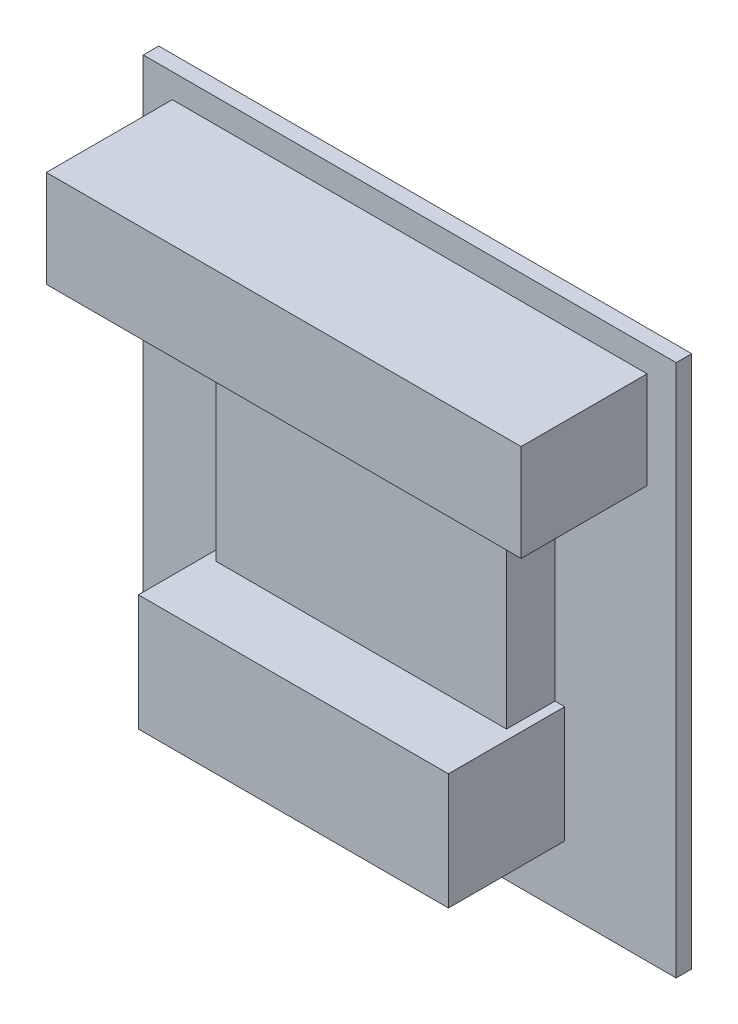
ISO-10303-21;
HEADER;
FILE_DESCRIPTION(('STEP AP214'),'2;1');
FILE_NAME('part.step','',(''),(''),'','','');
FILE_SCHEMA(('AUTOMOTIVE_DESIGN { 1 0 10303 214 1 1 1 1 }'));
ENDSEC;
DATA;
#1=APPLICATION_CONTEXT('core data for automotive mechanical design processes');
#2=APPLICATION_PROTOCOL_DEFINITION('international standard','automotive_design',2000,#1);
#3=PRODUCT_CONTEXT('',#1,'mechanical');
#4=PRODUCT('Part','Part','',(#3));
#5=PRODUCT_RELATED_PRODUCT_CATEGORY('part','',(#4));
#6=PRODUCT_DEFINITION_FORMATION('','',#4);
#7=PRODUCT_DEFINITION_CONTEXT('part definition',#1,'design');
#8=PRODUCT_DEFINITION('design','',#6,#7);
#9=PRODUCT_DEFINITION_SHAPE('','',#8);
#10=(LENGTH_UNIT() NAMED_UNIT(*) SI_UNIT(.MILLI.,.METRE.));
#11=(NAMED_UNIT(*) PLANE_ANGLE_UNIT() SI_UNIT($,.RADIAN.));
#12=(NAMED_UNIT(*) SI_UNIT($,.STERADIAN.) SOLID_ANGLE_UNIT());
#13=UNCERTAINTY_MEASURE_WITH_UNIT(LENGTH_MEASURE(1.E-05),#10,'distance_accuracy_value','');
#14=(GEOMETRIC_REPRESENTATION_CONTEXT(3) GLOBAL_UNCERTAINTY_ASSIGNED_CONTEXT((#13)) GLOBAL_UNIT_ASSIGNED_CONTEXT((#10,
#11,#12)) REPRESENTATION_CONTEXT('',''));
#15=CARTESIAN_POINT('',(0.,0.,0.));
#16=DIRECTION('',(0.,0.,1.));
#17=DIRECTION('',(1.,0.,0.));
#18=AXIS2_PLACEMENT_3D('',#15,#16,#17);
#19=CARTESIAN_POINT('',(-24.5,15.,14.6));
#20=DIRECTION('',(0.,0.,1.));
#21=DIRECTION('',(1.,0.,0.));
#22=AXIS2_PLACEMENT_3D('',#19,#20,#21);
#23=PLANE('',#22);
#24=DIRECTION('',(0.,1.,0.));
#25=VECTOR('',#24,1.);
#26=CARTESIAN_POINT('',(-24.5,15.,14.6));
#27=LINE('',#26,#25);
#28=CARTESIAN_POINT('',(-24.5,15.,14.6));
#29=VERTEX_POINT('',#28);
#30=CARTESIAN_POINT('',(-24.5,25.,14.6));
#31=VERTEX_POINT('',#30);
#32=EDGE_CURVE('E71',#29,#31,#27,.T.);
#33=ORIENTED_EDGE('',*,*,#32,.F.);
#34=DIRECTION('',(1.,0.,0.));
#35=VECTOR('',#34,1.);
#36=CARTESIAN_POINT('',(-24.5,15.,14.6));
#37=LINE('',#36,#35);
#38=CARTESIAN_POINT('',(24.5,15.,14.6));
#39=VERTEX_POINT('',#38);
#40=EDGE_CURVE('E19',#29,#39,#37,.T.);
#41=ORIENTED_EDGE('',*,*,#40,.T.);
#42=DIRECTION('',(0.,1.,0.));
#43=VECTOR('',#42,1.);
#44=CARTESIAN_POINT('',(24.5,15.,14.6));
#45=LINE('',#44,#43);
#46=CARTESIAN_POINT('',(24.5,25.,14.6));
#47=VERTEX_POINT('',#46);
#48=EDGE_CURVE('E26',#39,#47,#45,.T.);
#49=ORIENTED_EDGE('',*,*,#48,.T.);
#50=DIRECTION('',(1.,0.,0.));
#51=VECTOR('',#50,1.);
#52=CARTESIAN_POINT('',(-24.5,25.,14.6));
#53=LINE('',#52,#51);
#54=EDGE_CURVE('E10',#31,#47,#53,.T.);
#55=ORIENTED_EDGE('',*,*,#54,.F.);
#56=EDGE_LOOP('',(#33,#41,#49,#55));
#57=FACE_BOUND('',#56,.T.);
#58=ADVANCED_FACE('F16',(#57),#23,.T.);
#59=CARTESIAN_POINT('',(-15.,-10.,6.6));
#60=DIRECTION('',(0.,0.,1.));
#61=DIRECTION('',(1.,0.,0.));
#62=AXIS2_PLACEMENT_3D('',#59,#60,#61);
#63=PLANE('',#62);
#64=DIRECTION('',(0.,1.,0.));
#65=VECTOR('',#64,1.);
#66=CARTESIAN_POINT('',(-15.,-10.,6.6));
#67=LINE('',#66,#65);
#68=CARTESIAN_POINT('',(-15.,-9.,6.6));
#69=VERTEX_POINT('',#68);
#70=CARTESIAN_POINT('',(-15.,10.,6.6));
#71=VERTEX_POINT('',#70);
#72=EDGE_CURVE('E90',#69,#71,#67,.T.);
#73=ORIENTED_EDGE('',*,*,#72,.F.);
#74=DIRECTION('',(1.,0.,0.));
#75=VECTOR('',#74,1.);
#76=CARTESIAN_POINT('',(-15.5,-9.,6.6));
#77=LINE('',#76,#75);
#78=CARTESIAN_POINT('',(15.,-9.,6.6));
#79=VERTEX_POINT('',#78);
#80=EDGE_CURVE('E153',#69,#79,#77,.T.);
#81=ORIENTED_EDGE('',*,*,#80,.T.);
#82=DIRECTION('',(0.,1.,0.));
#83=VECTOR('',#82,1.);
#84=CARTESIAN_POINT('',(15.,-10.,6.6));
#85=LINE('',#84,#83);
#86=CARTESIAN_POINT('',(15.,10.,6.6));
#87=VERTEX_POINT('',#86);
#88=EDGE_CURVE('E161',#79,#87,#85,.T.);
#89=ORIENTED_EDGE('',*,*,#88,.T.);
#90=DIRECTION('',(1.,0.,0.));
#91=VECTOR('',#90,1.);
#92=CARTESIAN_POINT('',(-15.,10.,6.6));
#93=LINE('',#92,#91);
#94=EDGE_CURVE('E96',#71,#87,#93,.T.);
#95=ORIENTED_EDGE('',*,*,#94,.F.);
#96=EDGE_LOOP('',(#73,#81,#89,#95));
#97=FACE_BOUND('',#96,.T.);
#98=ADVANCED_FACE('F398',(#97),#63,.T.);
#99=CARTESIAN_POINT('',(-16.,-21.,13.6));
#100=DIRECTION('',(0.,0.,1.));
#101=DIRECTION('',(1.,0.,0.));
#102=AXIS2_PLACEMENT_3D('',#99,#100,#101);
#103=PLANE('',#102);
#104=DIRECTION('',(0.,1.,0.));
#105=VECTOR('',#104,1.);
#106=CARTESIAN_POINT('',(-16.,-21.,13.6));
#107=LINE('',#106,#105);
#108=CARTESIAN_POINT('',(-16.,-21.,13.6));
#109=VERTEX_POINT('',#108);
#110=CARTESIAN_POINT('',(-16.,-9.,13.6));
#111=VERTEX_POINT('',#110);
#112=EDGE_CURVE('E120',#109,#111,#107,.T.);
#113=ORIENTED_EDGE('',*,*,#112,.F.);
#114=DIRECTION('',(1.,0.,0.));
#115=VECTOR('',#114,1.);
#116=CARTESIAN_POINT('',(-16.,-21.,13.6));
#117=LINE('',#116,#115);
#118=CARTESIAN_POINT('',(16.,-21.,13.6));
#119=VERTEX_POINT('',#118);
#120=EDGE_CURVE('E130',#109,#119,#117,.T.);
#121=ORIENTED_EDGE('',*,*,#120,.T.);
#122=DIRECTION('',(0.,1.,0.));
#123=VECTOR('',#122,1.);
#124=CARTESIAN_POINT('',(16.,-21.,13.6));
#125=LINE('',#124,#123);
#126=CARTESIAN_POINT('',(16.,-9.,13.6));
#127=VERTEX_POINT('',#126);
#128=EDGE_CURVE('E141',#119,#127,#125,.T.);
#129=ORIENTED_EDGE('',*,*,#128,.T.);
#130=DIRECTION('',(1.,0.,0.));
#131=VECTOR('',#130,1.);
#132=CARTESIAN_POINT('',(-16.,-9.,13.6));
#133=LINE('',#132,#131);
#134=EDGE_CURVE('E148',#111,#127,#133,.T.);
#135=ORIENTED_EDGE('',*,*,#134,.F.);
#136=EDGE_LOOP('',(#113,#121,#129,#135));
#137=FACE_BOUND('',#136,.T.);
#138=ADVANCED_FACE('F367',(#137),#103,.T.);
#139=CARTESIAN_POINT('',(-24.5,25.,1.6));
#140=DIRECTION('',(0.,1.,0.));
#141=DIRECTION('',(1.,0.,0.));
#142=AXIS2_PLACEMENT_3D('',#139,#140,#141);
#143=PLANE('',#142);
#144=DIRECTION('',(1.,0.,0.));
#145=VECTOR('',#144,1.);
#146=CARTESIAN_POINT('',(-24.5,25.,1.6));
#147=LINE('',#146,#145);
#148=CARTESIAN_POINT('',(-24.5,25.,1.6));
#149=VERTEX_POINT('',#148);
#150=CARTESIAN_POINT('',(24.5,25.,1.6));
#151=VERTEX_POINT('',#150);
#152=EDGE_CURVE('E79',#149,#151,#147,.T.);
#153=ORIENTED_EDGE('',*,*,#152,.F.);
#154=DIRECTION('',(0.,0.,1.));
#155=VECTOR('',#154,1.);
#156=CARTESIAN_POINT('',(-24.5,25.,1.6));
#157=LINE('',#156,#155);
#158=EDGE_CURVE('E75',#149,#31,#157,.T.);
#159=ORIENTED_EDGE('',*,*,#158,.T.);
#160=ORIENTED_EDGE('',*,*,#54,.T.);
#161=DIRECTION('',(0.,0.,1.));
#162=VECTOR('',#161,1.);
#163=CARTESIAN_POINT('',(24.5,25.,1.6));
#164=LINE('',#163,#162);
#165=EDGE_CURVE('E144',#151,#47,#164,.T.);
#166=ORIENTED_EDGE('',*,*,#165,.F.);
#167=EDGE_LOOP('',(#153,#159,#160,#166));
#168=FACE_BOUND('',#167,.T.);
#169=ADVANCED_FACE('F76',(#168),#143,.T.);
#170=CARTESIAN_POINT('',(24.5,15.,1.6));
#171=DIRECTION('',(1.,0.,0.));
#172=DIRECTION('',(0.,1.,0.));
#173=AXIS2_PLACEMENT_3D('',#170,#171,#172);
#174=PLANE('',#173);
#175=DIRECTION('',(0.,0.,1.));
#176=VECTOR('',#175,1.);
#177=CARTESIAN_POINT('',(24.5,15.,1.6));
#178=LINE('',#177,#176);
#179=CARTESIAN_POINT('',(24.5,15.,1.6));
#180=VERTEX_POINT('',#179);
#181=EDGE_CURVE('E137',#180,#39,#178,.T.);
#182=ORIENTED_EDGE('',*,*,#181,.F.);
#183=DIRECTION('',(0.,1.,0.));
#184=VECTOR('',#183,1.);
#185=CARTESIAN_POINT('',(24.5,15.,1.6));
#186=LINE('',#185,#184);
#187=EDGE_CURVE('E101',#180,#151,#186,.T.);
#188=ORIENTED_EDGE('',*,*,#187,.T.);
#189=ORIENTED_EDGE('',*,*,#165,.T.);
#190=ORIENTED_EDGE('',*,*,#48,.F.);
#191=EDGE_LOOP('',(#182,#188,#189,#190));
#192=FACE_BOUND('',#191,.T.);
#193=ADVANCED_FACE('F411',(#192),#174,.T.);
#194=CARTESIAN_POINT('',(-24.5,15.,1.6));
#195=DIRECTION('',(0.,1.,0.));
#196=DIRECTION('',(1.,0.,0.));
#197=AXIS2_PLACEMENT_3D('',#194,#195,#196);
#198=PLANE('',#197);
#199=ORIENTED_EDGE('',*,*,#181,.T.);
#200=ORIENTED_EDGE('',*,*,#40,.F.);
#201=DIRECTION('',(0.,0.,1.));
#202=VECTOR('',#201,1.);
#203=CARTESIAN_POINT('',(-24.5,15.,1.6));
#204=LINE('',#203,#202);
#205=CARTESIAN_POINT('',(-24.5,15.,1.6));
#206=VERTEX_POINT('',#205);
#207=EDGE_CURVE('E84',#206,#29,#204,.T.);
#208=ORIENTED_EDGE('',*,*,#207,.F.);
#209=DIRECTION('',(1.,0.,0.));
#210=VECTOR('',#209,1.);
#211=CARTESIAN_POINT('',(-24.5,15.,1.6));
#212=LINE('',#211,#210);
#213=EDGE_CURVE('E104',#206,#180,#212,.T.);
#214=ORIENTED_EDGE('',*,*,#213,.T.);
#215=EDGE_LOOP('',(#199,#200,#208,#214));
#216=FACE_BOUND('',#215,.T.);
#217=ADVANCED_FACE('F419',(#216),#198,.F.);
#218=CARTESIAN_POINT('',(-24.5,15.,1.6));
#219=DIRECTION('',(1.,0.,0.));
#220=DIRECTION('',(0.,1.,0.));
#221=AXIS2_PLACEMENT_3D('',#218,#219,#220);
#222=PLANE('',#221);
#223=ORIENTED_EDGE('',*,*,#32,.T.);
#224=ORIENTED_EDGE('',*,*,#158,.F.);
#225=DIRECTION('',(0.,1.,0.));
#226=VECTOR('',#225,1.);
#227=CARTESIAN_POINT('',(-24.5,15.,1.6));
#228=LINE('',#227,#226);
#229=EDGE_CURVE('E187',#206,#149,#228,.T.);
#230=ORIENTED_EDGE('',*,*,#229,.F.);
#231=ORIENTED_EDGE('',*,*,#207,.T.);
#232=EDGE_LOOP('',(#223,#224,#230,#231));
#233=FACE_BOUND('',#232,.T.);
#234=ADVANCED_FACE('F87',(#233),#222,.F.);
#235=CARTESIAN_POINT('',(-15.,-10.,1.6));
#236=DIRECTION('',(1.,0.,0.));
#237=DIRECTION('',(0.,1.,0.));
#238=AXIS2_PLACEMENT_3D('',#235,#236,#237);
#239=PLANE('',#238);
#240=DIRECTION('',(0.,0.,1.));
#241=VECTOR('',#240,1.);
#242=CARTESIAN_POINT('',(-15.,10.,1.6));
#243=LINE('',#242,#241);
#244=CARTESIAN_POINT('',(-15.,10.,1.6));
#245=VERTEX_POINT('',#244);
#246=EDGE_CURVE('E169',#245,#71,#243,.T.);
#247=ORIENTED_EDGE('',*,*,#246,.F.);
#248=DIRECTION('',(0.,1.,0.));
#249=VECTOR('',#248,1.);
#250=CARTESIAN_POINT('',(-15.,-10.,1.6));
#251=LINE('',#250,#249);
#252=CARTESIAN_POINT('',(-15.,-9.,1.6));
#253=VERTEX_POINT('',#252);
#254=EDGE_CURVE('E210',#253,#245,#251,.T.);
#255=ORIENTED_EDGE('',*,*,#254,.F.);
#256=DIRECTION('',(0.,0.,-1.));
#257=VECTOR('',#256,1.);
#258=CARTESIAN_POINT('',(-15.,-9.,1.6));
#259=LINE('',#258,#257);
#260=EDGE_CURVE('E157',#69,#253,#259,.T.);
#261=ORIENTED_EDGE('',*,*,#260,.F.);
#262=ORIENTED_EDGE('',*,*,#72,.T.);
#263=EDGE_LOOP('',(#247,#255,#261,#262));
#264=FACE_BOUND('',#263,.T.);
#265=ADVANCED_FACE('F418',(#264),#239,.F.);
#266=CARTESIAN_POINT('',(-15.,10.,1.6));
#267=DIRECTION('',(0.,1.,0.));
#268=DIRECTION('',(1.,0.,0.));
#269=AXIS2_PLACEMENT_3D('',#266,#267,#268);
#270=PLANE('',#269);
#271=DIRECTION('',(1.,0.,0.));
#272=VECTOR('',#271,1.);
#273=CARTESIAN_POINT('',(-15.,10.,1.6));
#274=LINE('',#273,#272);
#275=CARTESIAN_POINT('',(15.,10.,1.6));
#276=VERTEX_POINT('',#275);
#277=EDGE_CURVE('E205',#245,#276,#274,.T.);
#278=ORIENTED_EDGE('',*,*,#277,.F.);
#279=ORIENTED_EDGE('',*,*,#246,.T.);
#280=ORIENTED_EDGE('',*,*,#94,.T.);
#281=DIRECTION('',(0.,0.,1.));
#282=VECTOR('',#281,1.);
#283=CARTESIAN_POINT('',(15.,10.,1.6));
#284=LINE('',#283,#282);
#285=EDGE_CURVE('E165',#276,#87,#284,.T.);
#286=ORIENTED_EDGE('',*,*,#285,.F.);
#287=EDGE_LOOP('',(#278,#279,#280,#286));
#288=FACE_BOUND('',#287,.T.);
#289=ADVANCED_FACE('F426',(#288),#270,.T.);
#290=CARTESIAN_POINT('',(15.,-10.,1.6));
#291=DIRECTION('',(1.,0.,0.));
#292=DIRECTION('',(0.,1.,0.));
#293=AXIS2_PLACEMENT_3D('',#290,#291,#292);
#294=PLANE('',#293);
#295=ORIENTED_EDGE('',*,*,#88,.F.);
#296=DIRECTION('',(0.,0.,-1.));
#297=VECTOR('',#296,1.);
#298=CARTESIAN_POINT('',(15.,-9.,1.6));
#299=LINE('',#298,#297);
#300=CARTESIAN_POINT('',(15.,-9.,1.6));
#301=VERTEX_POINT('',#300);
#302=EDGE_CURVE('E152',#79,#301,#299,.T.);
#303=ORIENTED_EDGE('',*,*,#302,.T.);
#304=DIRECTION('',(0.,1.,0.));
#305=VECTOR('',#304,1.);
#306=CARTESIAN_POINT('',(15.,-10.,1.6));
#307=LINE('',#306,#305);
#308=EDGE_CURVE('E198',#301,#276,#307,.T.);
#309=ORIENTED_EDGE('',*,*,#308,.T.);
#310=ORIENTED_EDGE('',*,*,#285,.T.);
#311=EDGE_LOOP('',(#295,#303,#309,#310));
#312=FACE_BOUND('',#311,.T.);
#313=ADVANCED_FACE('F434',(#312),#294,.T.);
#314=CARTESIAN_POINT('',(-16.,-9.,1.6));
#315=DIRECTION('',(0.,1.,0.));
#316=DIRECTION('',(1.,0.,0.));
#317=AXIS2_PLACEMENT_3D('',#314,#315,#316);
#318=PLANE('',#317);
#319=DIRECTION('',(1.,0.,0.));
#320=VECTOR('',#319,1.);
#321=CARTESIAN_POINT('',(-16.,-9.,1.6));
#322=LINE('',#321,#320);
#323=CARTESIAN_POINT('',(-16.,-9.,1.6));
#324=VERTEX_POINT('',#323);
#325=EDGE_CURVE('E206',#324,#253,#322,.T.);
#326=ORIENTED_EDGE('',*,*,#325,.F.);
#327=DIRECTION('',(0.,0.,1.));
#328=VECTOR('',#327,1.);
#329=CARTESIAN_POINT('',(-16.,-9.,1.6));
#330=LINE('',#329,#328);
#331=EDGE_CURVE('E121',#324,#111,#330,.T.);
#332=ORIENTED_EDGE('',*,*,#331,.T.);
#333=ORIENTED_EDGE('',*,*,#134,.T.);
#334=DIRECTION('',(0.,0.,1.));
#335=VECTOR('',#334,1.);
#336=CARTESIAN_POINT('',(16.,-9.,1.6));
#337=LINE('',#336,#335);
#338=CARTESIAN_POINT('',(16.,-9.,1.6));
#339=VERTEX_POINT('',#338);
#340=EDGE_CURVE('E134',#339,#127,#337,.T.);
#341=ORIENTED_EDGE('',*,*,#340,.F.);
#342=DIRECTION('',(1.,0.,0.));
#343=VECTOR('',#342,1.);
#344=CARTESIAN_POINT('',(-16.,-9.,1.6));
#345=LINE('',#344,#343);
#346=EDGE_CURVE('E194',#301,#339,#345,.T.);
#347=ORIENTED_EDGE('',*,*,#346,.F.);
#348=ORIENTED_EDGE('',*,*,#302,.F.);
#349=ORIENTED_EDGE('',*,*,#80,.F.);
#350=ORIENTED_EDGE('',*,*,#260,.T.);
#351=EDGE_LOOP('',(#326,#332,#333,#341,#347,#348,#349,#350));
#352=FACE_BOUND('',#351,.T.);
#353=ADVANCED_FACE('F381',(#352),#318,.T.);
#354=CARTESIAN_POINT('',(16.,-21.,1.6));
#355=DIRECTION('',(1.,0.,0.));
#356=DIRECTION('',(0.,1.,0.));
#357=AXIS2_PLACEMENT_3D('',#354,#355,#356);
#358=PLANE('',#357);
#359=DIRECTION('',(0.,0.,1.));
#360=VECTOR('',#359,1.);
#361=CARTESIAN_POINT('',(16.,-21.,1.6));
#362=LINE('',#361,#360);
#363=CARTESIAN_POINT('',(16.,-21.,1.6));
#364=VERTEX_POINT('',#363);
#365=EDGE_CURVE('E129',#364,#119,#362,.T.);
#366=ORIENTED_EDGE('',*,*,#365,.F.);
#367=DIRECTION('',(0.,1.,0.));
#368=VECTOR('',#367,1.);
#369=CARTESIAN_POINT('',(16.,-21.,1.6));
#370=LINE('',#369,#368);
#371=EDGE_CURVE('E193',#364,#339,#370,.T.);
#372=ORIENTED_EDGE('',*,*,#371,.T.);
#373=ORIENTED_EDGE('',*,*,#340,.T.);
#374=ORIENTED_EDGE('',*,*,#128,.F.);
#375=EDGE_LOOP('',(#366,#372,#373,#374));
#376=FACE_BOUND('',#375,.T.);
#377=ADVANCED_FACE('F366',(#376),#358,.T.);
#378=CARTESIAN_POINT('',(-16.,-21.,1.6));
#379=DIRECTION('',(0.,1.,0.));
#380=DIRECTION('',(1.,0.,0.));
#381=AXIS2_PLACEMENT_3D('',#378,#379,#380);
#382=PLANE('',#381);
#383=ORIENTED_EDGE('',*,*,#365,.T.);
#384=ORIENTED_EDGE('',*,*,#120,.F.);
#385=DIRECTION('',(0.,0.,1.));
#386=VECTOR('',#385,1.);
#387=CARTESIAN_POINT('',(-16.,-21.,1.6));
#388=LINE('',#387,#386);
#389=CARTESIAN_POINT('',(-16.,-21.,1.6));
#390=VERTEX_POINT('',#389);
#391=EDGE_CURVE('E124',#390,#109,#388,.T.);
#392=ORIENTED_EDGE('',*,*,#391,.F.);
#393=DIRECTION('',(1.,0.,0.));
#394=VECTOR('',#393,1.);
#395=CARTESIAN_POINT('',(-16.,-21.,1.6));
#396=LINE('',#395,#394);
#397=EDGE_CURVE('E189',#390,#364,#396,.T.);
#398=ORIENTED_EDGE('',*,*,#397,.T.);
#399=EDGE_LOOP('',(#383,#384,#392,#398));
#400=FACE_BOUND('',#399,.T.);
#401=ADVANCED_FACE('F369',(#400),#382,.F.);
#402=CARTESIAN_POINT('',(-16.,-21.,1.6));
#403=DIRECTION('',(1.,0.,0.));
#404=DIRECTION('',(0.,1.,0.));
#405=AXIS2_PLACEMENT_3D('',#402,#403,#404);
#406=PLANE('',#405);
#407=ORIENTED_EDGE('',*,*,#112,.T.);
#408=ORIENTED_EDGE('',*,*,#331,.F.);
#409=DIRECTION('',(0.,1.,0.));
#410=VECTOR('',#409,1.);
#411=CARTESIAN_POINT('',(-16.,-21.,1.6));
#412=LINE('',#411,#410);
#413=EDGE_CURVE('E211',#390,#324,#412,.T.);
#414=ORIENTED_EDGE('',*,*,#413,.F.);
#415=ORIENTED_EDGE('',*,*,#391,.T.);
#416=EDGE_LOOP('',(#407,#408,#414,#415));
#417=FACE_BOUND('',#416,.T.);
#418=ADVANCED_FACE('F385',(#417),#406,.F.);
#419=CARTESIAN_POINT('',(27.5,-27.5,0.));
#420=DIRECTION('',(1.,0.,0.));
#421=DIRECTION('',(0.,1.,0.));
#422=AXIS2_PLACEMENT_3D('',#419,#420,#421);
#423=PLANE('',#422);
#424=DIRECTION('',(0.,0.,1.));
#425=VECTOR('',#424,1.);
#426=CARTESIAN_POINT('',(27.5,-27.5,0.));
#427=LINE('',#426,#425);
#428=CARTESIAN_POINT('',(27.5,-27.5,0.));
#429=VERTEX_POINT('',#428);
#430=CARTESIAN_POINT('',(27.5,-27.5,1.6));
#431=VERTEX_POINT('',#430);
#432=EDGE_CURVE('E231',#429,#431,#427,.T.);
#433=ORIENTED_EDGE('',*,*,#432,.F.);
#434=DIRECTION('',(0.,1.,0.));
#435=VECTOR('',#434,1.);
#436=CARTESIAN_POINT('',(27.5,-27.5,0.));
#437=LINE('',#436,#435);
#438=CARTESIAN_POINT('',(27.5,27.5,0.));
#439=VERTEX_POINT('',#438);
#440=EDGE_CURVE('E116',#429,#439,#437,.T.);
#441=ORIENTED_EDGE('',*,*,#440,.T.);
#442=DIRECTION('',(0.,0.,1.));
#443=VECTOR('',#442,1.);
#444=CARTESIAN_POINT('',(27.5,27.5,0.));
#445=LINE('',#444,#443);
#446=CARTESIAN_POINT('',(27.5,27.5,1.6));
#447=VERTEX_POINT('',#446);
#448=EDGE_CURVE('E112',#439,#447,#445,.T.);
#449=ORIENTED_EDGE('',*,*,#448,.T.);
#450=DIRECTION('',(0.,1.,0.));
#451=VECTOR('',#450,1.);
#452=CARTESIAN_POINT('',(27.5,-27.5,1.6));
#453=LINE('',#452,#451);
#454=EDGE_CURVE('E219',#431,#447,#453,.T.);
#455=ORIENTED_EDGE('',*,*,#454,.F.);
#456=EDGE_LOOP('',(#433,#441,#449,#455));
#457=FACE_BOUND('',#456,.T.);
#458=ADVANCED_FACE('F282',(#457),#423,.T.);
#459=CARTESIAN_POINT('',(-27.5,-27.5,0.));
#460=DIRECTION('',(0.,0.,1.));
#461=DIRECTION('',(1.,0.,0.));
#462=AXIS2_PLACEMENT_3D('',#459,#460,#461);
#463=PLANE('',#462);
#464=DIRECTION('',(1.,0.,0.));
#465=VECTOR('',#464,1.);
#466=CARTESIAN_POINT('',(-27.5,27.5,0.));
#467=LINE('',#466,#465);
#468=CARTESIAN_POINT('',(-27.5,27.5,0.));
#469=VERTEX_POINT('',#468);
#470=EDGE_CURVE('E107',#469,#439,#467,.T.);
#471=ORIENTED_EDGE('',*,*,#470,.T.);
#472=ORIENTED_EDGE('',*,*,#440,.F.);
#473=DIRECTION('',(1.,0.,0.));
#474=VECTOR('',#473,1.);
#475=CARTESIAN_POINT('',(-27.5,-27.5,0.));
#476=LINE('',#475,#474);
#477=CARTESIAN_POINT('',(-27.5,-27.5,0.));
#478=VERTEX_POINT('',#477);
#479=EDGE_CURVE('E223',#478,#429,#476,.T.);
#480=ORIENTED_EDGE('',*,*,#479,.F.);
#481=DIRECTION('',(0.,1.,0.));
#482=VECTOR('',#481,1.);
#483=CARTESIAN_POINT('',(-27.5,-27.5,0.));
#484=LINE('',#483,#482);
#485=EDGE_CURVE('E245',#478,#469,#484,.T.);
#486=ORIENTED_EDGE('',*,*,#485,.T.);
#487=EDGE_LOOP('',(#471,#472,#480,#486));
#488=FACE_BOUND('',#487,.T.);
#489=ADVANCED_FACE('F302',(#488),#463,.F.);
#490=CARTESIAN_POINT('',(-27.5,27.5,0.));
#491=DIRECTION('',(0.,1.,0.));
#492=DIRECTION('',(1.,0.,0.));
#493=AXIS2_PLACEMENT_3D('',#490,#491,#492);
#494=PLANE('',#493);
#495=ORIENTED_EDGE('',*,*,#470,.F.);
#496=DIRECTION('',(0.,0.,1.));
#497=VECTOR('',#496,1.);
#498=CARTESIAN_POINT('',(-27.5,27.5,0.));
#499=LINE('',#498,#497);
#500=CARTESIAN_POINT('',(-27.5,27.5,1.6));
#501=VERTEX_POINT('',#500);
#502=EDGE_CURVE('E249',#469,#501,#499,.T.);
#503=ORIENTED_EDGE('',*,*,#502,.T.);
#504=DIRECTION('',(1.,0.,0.));
#505=VECTOR('',#504,1.);
#506=CARTESIAN_POINT('',(-27.5,27.5,1.6));
#507=LINE('',#506,#505);
#508=EDGE_CURVE('E215',#501,#447,#507,.T.);
#509=ORIENTED_EDGE('',*,*,#508,.T.);
#510=ORIENTED_EDGE('',*,*,#448,.F.);
#511=EDGE_LOOP('',(#495,#503,#509,#510));
#512=FACE_BOUND('',#511,.T.);
#513=ADVANCED_FACE('F488',(#512),#494,.T.);
#514=CARTESIAN_POINT('',(-27.5,-27.5,1.6));
#515=DIRECTION('',(0.,0.,1.));
#516=DIRECTION('',(1.,0.,0.));
#517=AXIS2_PLACEMENT_3D('',#514,#515,#516);
#518=PLANE('',#517);
#519=ORIENTED_EDGE('',*,*,#229,.T.);
#520=ORIENTED_EDGE('',*,*,#152,.T.);
#521=ORIENTED_EDGE('',*,*,#187,.F.);
#522=ORIENTED_EDGE('',*,*,#213,.F.);
#523=EDGE_LOOP('',(#519,#520,#521,#522));
#524=FACE_BOUND('',#523,.T.);
#525=ORIENTED_EDGE('',*,*,#413,.T.);
#526=ORIENTED_EDGE('',*,*,#325,.T.);
#527=ORIENTED_EDGE('',*,*,#254,.T.);
#528=ORIENTED_EDGE('',*,*,#277,.T.);
#529=ORIENTED_EDGE('',*,*,#308,.F.);
#530=ORIENTED_EDGE('',*,*,#346,.T.);
#531=ORIENTED_EDGE('',*,*,#371,.F.);
#532=ORIENTED_EDGE('',*,*,#397,.F.);
#533=EDGE_LOOP('',(#525,#526,#527,#528,#529,#530,#531,#532));
#534=FACE_BOUND('',#533,.T.);
#535=DIRECTION('',(0.,1.,0.));
#536=VECTOR('',#535,1.);
#537=CARTESIAN_POINT('',(-27.5,-27.5,1.6));
#538=LINE('',#537,#536);
#539=CARTESIAN_POINT('',(-27.5,-27.5,1.6));
#540=VERTEX_POINT('',#539);
#541=EDGE_CURVE('E259',#540,#501,#538,.T.);
#542=ORIENTED_EDGE('',*,*,#541,.F.);
#543=DIRECTION('',(1.,0.,0.));
#544=VECTOR('',#543,1.);
#545=CARTESIAN_POINT('',(-27.5,-27.5,1.6));
#546=LINE('',#545,#544);
#547=EDGE_CURVE('E227',#540,#431,#546,.T.);
#548=ORIENTED_EDGE('',*,*,#547,.T.);
#549=ORIENTED_EDGE('',*,*,#454,.T.);
#550=ORIENTED_EDGE('',*,*,#508,.F.);
#551=EDGE_LOOP('',(#542,#548,#549,#550));
#552=FACE_BOUND('',#551,.T.);
#553=ADVANCED_FACE('F291',(#524,#534,#552),#518,.T.);
#554=CARTESIAN_POINT('',(-27.5,-27.5,0.));
#555=DIRECTION('',(0.,1.,0.));
#556=DIRECTION('',(1.,0.,0.));
#557=AXIS2_PLACEMENT_3D('',#554,#555,#556);
#558=PLANE('',#557);
#559=ORIENTED_EDGE('',*,*,#432,.T.);
#560=ORIENTED_EDGE('',*,*,#547,.F.);
#561=DIRECTION('',(0.,0.,1.));
#562=VECTOR('',#561,1.);
#563=CARTESIAN_POINT('',(-27.5,-27.5,0.));
#564=LINE('',#563,#562);
#565=EDGE_CURVE('E241',#478,#540,#564,.T.);
#566=ORIENTED_EDGE('',*,*,#565,.F.);
#567=ORIENTED_EDGE('',*,*,#479,.T.);
#568=EDGE_LOOP('',(#559,#560,#566,#567));
#569=FACE_BOUND('',#568,.T.);
#570=ADVANCED_FACE('F271',(#569),#558,.F.);
#571=CARTESIAN_POINT('',(-27.5,-27.5,0.));
#572=DIRECTION('',(1.,0.,0.));
#573=DIRECTION('',(0.,1.,0.));
#574=AXIS2_PLACEMENT_3D('',#571,#572,#573);
#575=PLANE('',#574);
#576=ORIENTED_EDGE('',*,*,#541,.T.);
#577=ORIENTED_EDGE('',*,*,#502,.F.);
#578=ORIENTED_EDGE('',*,*,#485,.F.);
#579=ORIENTED_EDGE('',*,*,#565,.T.);
#580=EDGE_LOOP('',(#576,#577,#578,#579));
#581=FACE_BOUND('',#580,.T.);
#582=ADVANCED_FACE('F297',(#581),#575,.F.);
#583=CLOSED_SHELL('',(#58,#98,#138,#169,#193,#217,#234,#265,#289,#313,#353,#377,#401,#418,#458,
#489,#513,#553,#570,#582));
#584=MANIFOLD_SOLID_BREP('B1',#583);
#585=ADVANCED_BREP_SHAPE_REPRESENTATION('',(#18,#584),#14);
#586=SHAPE_DEFINITION_REPRESENTATION(#9,#585);
ENDSEC;
END-ISO-10303-21;
